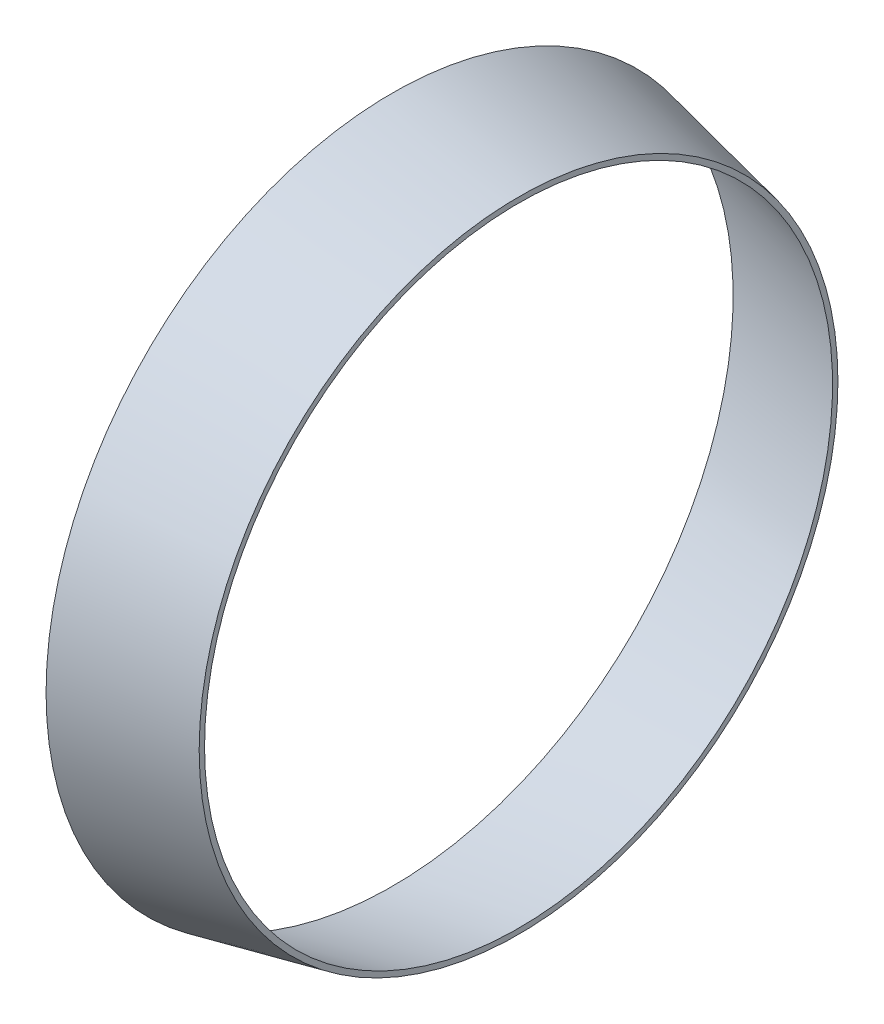
ISO-10303-21;
HEADER;
FILE_DESCRIPTION(('STEP AP214'),'2;1');
FILE_NAME('part.step','',(''),(''),'','','');
FILE_SCHEMA(('AUTOMOTIVE_DESIGN { 1 0 10303 214 1 1 1 1 }'));
ENDSEC;
DATA;
#1=APPLICATION_CONTEXT('core data for automotive mechanical design processes');
#2=APPLICATION_PROTOCOL_DEFINITION('international standard','automotive_design',2000,#1);
#3=PRODUCT_CONTEXT('',#1,'mechanical');
#4=PRODUCT('Part','Part','',(#3));
#5=PRODUCT_RELATED_PRODUCT_CATEGORY('part','',(#4));
#6=PRODUCT_DEFINITION_FORMATION('','',#4);
#7=PRODUCT_DEFINITION_CONTEXT('part definition',#1,'design');
#8=PRODUCT_DEFINITION('design','',#6,#7);
#9=PRODUCT_DEFINITION_SHAPE('','',#8);
#10=(LENGTH_UNIT() NAMED_UNIT(*) SI_UNIT(.MILLI.,.METRE.));
#11=(NAMED_UNIT(*) PLANE_ANGLE_UNIT() SI_UNIT($,.RADIAN.));
#12=(NAMED_UNIT(*) SI_UNIT($,.STERADIAN.) SOLID_ANGLE_UNIT());
#13=UNCERTAINTY_MEASURE_WITH_UNIT(LENGTH_MEASURE(1.E-05),#10,'distance_accuracy_value','');
#14=(GEOMETRIC_REPRESENTATION_CONTEXT(3) GLOBAL_UNCERTAINTY_ASSIGNED_CONTEXT((#13)) GLOBAL_UNIT_ASSIGNED_CONTEXT((#10,
#11,#12)) REPRESENTATION_CONTEXT('',''));
#15=CARTESIAN_POINT('',(0.,0.,0.));
#16=DIRECTION('',(0.,0.,1.));
#17=DIRECTION('',(1.,0.,0.));
#18=AXIS2_PLACEMENT_3D('',#15,#16,#17);
#19=CARTESIAN_POINT('',(23.5231505473931,0.,0.));
#20=DIRECTION('',(-1.,0.,0.));
#21=DIRECTION('',(0.,0.,1.));
#22=AXIS2_PLACEMENT_3D('',#19,#20,#21);
#23=CONICAL_SURFACE('',#22,59.5,0.209439510239313);
#24=CARTESIAN_POINT('',(0.,0.,0.));
#25=DIRECTION('',(-1.,0.,0.));
#26=DIRECTION('',(0.,0.,1.));
#27=AXIS2_PLACEMENT_3D('',#24,#25,#26);
#28=CIRCLE('',#27,64.5);
#29=CARTESIAN_POINT('',(0.,0.,64.5));
#30=VERTEX_POINT('',#29);
#31=EDGE_CURVE('E10',#30,#30,#28,.T.);
#32=ORIENTED_EDGE('',*,*,#31,.F.);
#33=EDGE_LOOP('',(#32));
#34=FACE_BOUND('',#33,.T.);
#35=CARTESIAN_POINT('',(23.5231505473931,0.,0.));
#36=DIRECTION('',(-1.,0.,0.));
#37=DIRECTION('',(0.,0.,1.));
#38=AXIS2_PLACEMENT_3D('',#35,#36,#37);
#39=CIRCLE('',#38,59.5);
#40=CARTESIAN_POINT('',(23.5231505473931,0.,59.5));
#41=VERTEX_POINT('',#40);
#42=EDGE_CURVE('E56',#41,#41,#39,.T.);
#43=ORIENTED_EDGE('',*,*,#42,.T.);
#44=EDGE_LOOP('',(#43));
#45=FACE_BOUND('',#44,.T.);
#46=ADVANCED_FACE('F39',(#34,#45),#23,.T.);
#47=CARTESIAN_POINT('',(0.,64.5,0.));
#48=DIRECTION('',(1.,0.,0.));
#49=DIRECTION('',(0.,0.,-1.));
#50=AXIS2_PLACEMENT_3D('',#47,#48,#49);
#51=PLANE('',#50);
#52=CARTESIAN_POINT('',(0.,0.,0.));
#53=DIRECTION('',(-1.,0.,0.));
#54=DIRECTION('',(0.,0.,1.));
#55=AXIS2_PLACEMENT_3D('',#52,#53,#54);
#56=CIRCLE('',#55,63.5);
#57=CARTESIAN_POINT('',(0.,0.,63.5));
#58=VERTEX_POINT('',#57);
#59=EDGE_CURVE('E46',#58,#58,#56,.T.);
#60=ORIENTED_EDGE('',*,*,#59,.F.);
#61=EDGE_LOOP('',(#60));
#62=FACE_BOUND('',#61,.T.);
#63=ORIENTED_EDGE('',*,*,#31,.T.);
#64=EDGE_LOOP('',(#63));
#65=FACE_BOUND('',#64,.T.);
#66=ADVANCED_FACE('F72',(#62,#65),#51,.F.);
#67=CARTESIAN_POINT('',(0.,0.,0.));
#68=DIRECTION('',(-1.,0.,0.));
#69=DIRECTION('',(0.,0.,1.));
#70=AXIS2_PLACEMENT_3D('',#67,#68,#69);
#71=CONICAL_SURFACE('',#70,63.5,0.209439510239313);
#72=CARTESIAN_POINT('',(23.5231505473931,0.,0.));
#73=DIRECTION('',(-1.,0.,0.));
#74=DIRECTION('',(0.,0.,1.));
#75=AXIS2_PLACEMENT_3D('',#72,#73,#74);
#76=CIRCLE('',#75,58.5);
#77=CARTESIAN_POINT('',(23.5231505473931,0.,58.5));
#78=VERTEX_POINT('',#77);
#79=EDGE_CURVE('E51',#78,#78,#76,.T.);
#80=ORIENTED_EDGE('',*,*,#79,.F.);
#81=EDGE_LOOP('',(#80));
#82=FACE_BOUND('',#81,.T.);
#83=ORIENTED_EDGE('',*,*,#59,.T.);
#84=EDGE_LOOP('',(#83));
#85=FACE_BOUND('',#84,.T.);
#86=ADVANCED_FACE('F67',(#82,#85),#71,.F.);
#87=CARTESIAN_POINT('',(23.5231505473931,58.5,0.));
#88=DIRECTION('',(-1.,0.,0.));
#89=DIRECTION('',(0.,0.,1.));
#90=AXIS2_PLACEMENT_3D('',#87,#88,#89);
#91=PLANE('',#90);
#92=ORIENTED_EDGE('',*,*,#42,.F.);
#93=EDGE_LOOP('',(#92));
#94=FACE_BOUND('',#93,.T.);
#95=ORIENTED_EDGE('',*,*,#79,.T.);
#96=EDGE_LOOP('',(#95));
#97=FACE_BOUND('',#96,.T.);
#98=ADVANCED_FACE('F64',(#94,#97),#91,.F.);
#99=CLOSED_SHELL('',(#46,#66,#86,#98));
#100=MANIFOLD_SOLID_BREP('B2',#99);
#101=ADVANCED_BREP_SHAPE_REPRESENTATION('',(#18,#100),#14);
#102=SHAPE_DEFINITION_REPRESENTATION(#9,#101);
ENDSEC;
END-ISO-10303-21;
